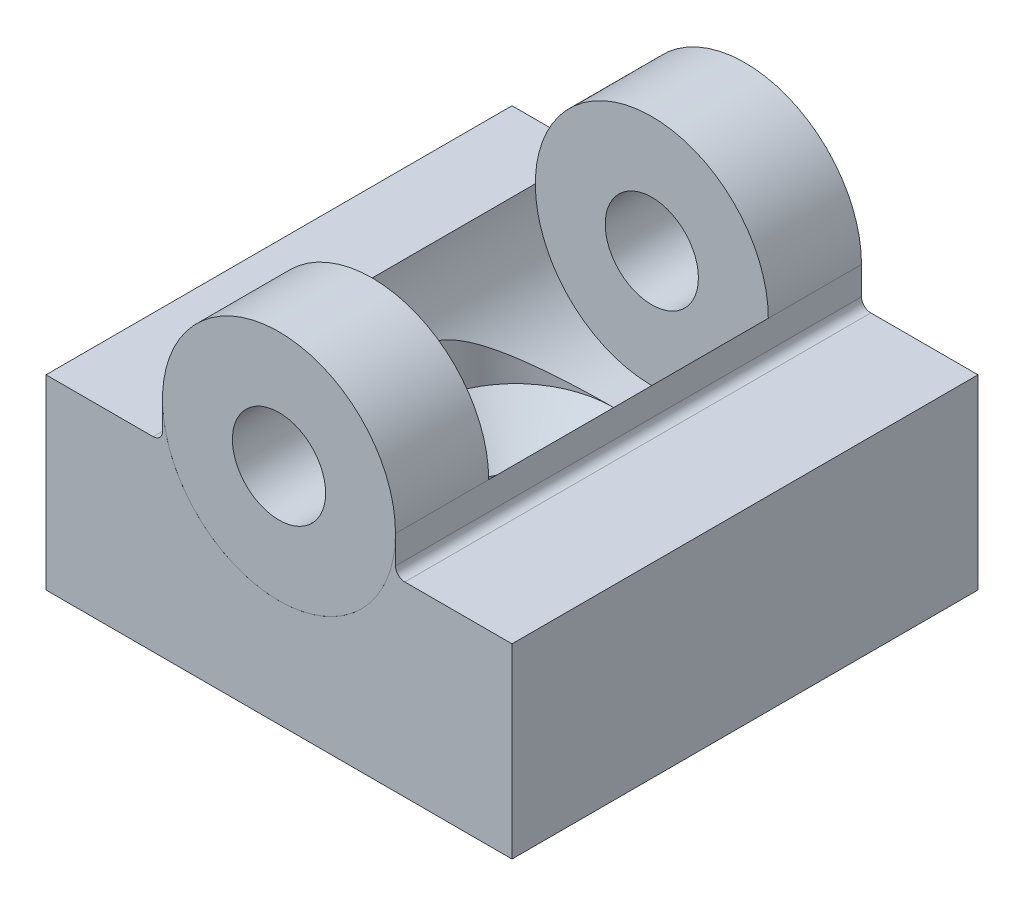
ISO-10303-21;
HEADER;
FILE_DESCRIPTION(('STEP AP214'),'2;1');
FILE_NAME('part.step','',(''),(''),'','','');
FILE_SCHEMA(('AUTOMOTIVE_DESIGN { 1 0 10303 214 1 1 1 1 }'));
ENDSEC;
DATA;
#1=APPLICATION_CONTEXT('core data for automotive mechanical design processes');
#2=APPLICATION_PROTOCOL_DEFINITION('international standard','automotive_design',2000,#1);
#3=PRODUCT_CONTEXT('',#1,'mechanical');
#4=PRODUCT('Part','Part','',(#3));
#5=PRODUCT_RELATED_PRODUCT_CATEGORY('part','',(#4));
#6=PRODUCT_DEFINITION_FORMATION('','',#4);
#7=PRODUCT_DEFINITION_CONTEXT('part definition',#1,'design');
#8=PRODUCT_DEFINITION('design','',#6,#7);
#9=PRODUCT_DEFINITION_SHAPE('','',#8);
#10=(LENGTH_UNIT() NAMED_UNIT(*) SI_UNIT(.MILLI.,.METRE.));
#11=(NAMED_UNIT(*) PLANE_ANGLE_UNIT() SI_UNIT($,.RADIAN.));
#12=(NAMED_UNIT(*) SI_UNIT($,.STERADIAN.) SOLID_ANGLE_UNIT());
#13=UNCERTAINTY_MEASURE_WITH_UNIT(LENGTH_MEASURE(1.E-05),#10,'distance_accuracy_value','');
#14=(GEOMETRIC_REPRESENTATION_CONTEXT(3) GLOBAL_UNCERTAINTY_ASSIGNED_CONTEXT((#13)) GLOBAL_UNIT_ASSIGNED_CONTEXT((#10,
#11,#12)) REPRESENTATION_CONTEXT('',''));
#15=CARTESIAN_POINT('',(0.,0.,0.));
#16=DIRECTION('',(0.,0.,1.));
#17=DIRECTION('',(1.,0.,0.));
#18=AXIS2_PLACEMENT_3D('',#15,#16,#17);
#19=CARTESIAN_POINT('',(0.,0.,-25.));
#20=DIRECTION('',(0.,0.,1.));
#21=DIRECTION('',(1.,0.,0.));
#22=AXIS2_PLACEMENT_3D('',#19,#20,#21);
#23=CYLINDRICAL_SURFACE('',#22,6.25);
#24=CARTESIAN_POINT('',(0.,0.,-5.));
#25=DIRECTION('',(0.,0.,-1.));
#26=DIRECTION('',(-1.,0.,0.));
#27=AXIS2_PLACEMENT_3D('',#24,#25,#26);
#28=CIRCLE('',#27,6.25);
#29=CARTESIAN_POINT('',(-6.25,0.,-5.));
#30=VERTEX_POINT('',#29);
#31=EDGE_CURVE('E63',#30,#30,#28,.F.);
#32=ORIENTED_EDGE('',*,*,#31,.T.);
#33=EDGE_LOOP('',(#32));
#34=FACE_BOUND('',#33,.T.);
#35=CARTESIAN_POINT('',(0.,0.,0.));
#36=DIRECTION('',(0.,0.,1.));
#37=DIRECTION('',(1.,0.,0.));
#38=AXIS2_PLACEMENT_3D('',#35,#36,#37);
#39=CIRCLE('',#38,6.25);
#40=CARTESIAN_POINT('',(6.25,0.,0.));
#41=VERTEX_POINT('',#40);
#42=EDGE_CURVE('E61',#41,#41,#39,.T.);
#43=ORIENTED_EDGE('',*,*,#42,.F.);
#44=EDGE_LOOP('',(#43));
#45=FACE_BOUND('',#44,.T.);
#46=ADVANCED_FACE('F50',(#34,#45),#23,.T.);
#47=CARTESIAN_POINT('',(0.,0.,0.));
#48=DIRECTION('',(0.,0.,1.));
#49=DIRECTION('',(1.,0.,0.));
#50=AXIS2_PLACEMENT_3D('',#47,#48,#49);
#51=PLANE('',#50);
#52=CARTESIAN_POINT('',(0.,0.,0.));
#53=DIRECTION('',(0.,0.,1.));
#54=DIRECTION('',(1.,0.,0.));
#55=AXIS2_PLACEMENT_3D('',#52,#53,#54);
#56=CIRCLE('',#55,2.5);
#57=CARTESIAN_POINT('',(2.5,0.,0.));
#58=VERTEX_POINT('',#57);
#59=EDGE_CURVE('E11',#58,#58,#56,.T.);
#60=ORIENTED_EDGE('',*,*,#59,.F.);
#61=EDGE_LOOP('',(#60));
#62=FACE_BOUND('',#61,.T.);
#63=ORIENTED_EDGE('',*,*,#42,.T.);
#64=EDGE_LOOP('',(#63));
#65=FACE_BOUND('',#64,.T.);
#66=ADVANCED_FACE('F70',(#62,#65),#51,.T.);
#67=CARTESIAN_POINT('',(0.,0.,-25.));
#68=DIRECTION('',(0.,0.,1.));
#69=DIRECTION('',(1.,0.,0.));
#70=AXIS2_PLACEMENT_3D('',#67,#68,#69);
#71=CYLINDRICAL_SURFACE('',#70,2.5);
#72=CARTESIAN_POINT('',(0.,0.,-5.));
#73=DIRECTION('',(0.,0.,1.));
#74=DIRECTION('',(1.,0.,0.));
#75=AXIS2_PLACEMENT_3D('',#72,#73,#74);
#76=CIRCLE('',#75,2.5);
#77=CARTESIAN_POINT('',(2.5,0.,-5.));
#78=VERTEX_POINT('',#77);
#79=EDGE_CURVE('E53',#78,#78,#76,.F.);
#80=ORIENTED_EDGE('',*,*,#79,.T.);
#81=EDGE_LOOP('',(#80));
#82=FACE_BOUND('',#81,.T.);
#83=ORIENTED_EDGE('',*,*,#59,.T.);
#84=EDGE_LOOP('',(#83));
#85=FACE_BOUND('',#84,.T.);
#86=ADVANCED_FACE('F76',(#82,#85),#71,.F.);
#87=CARTESIAN_POINT('',(12.5,8.,-5.));
#88=DIRECTION('',(0.,0.,-1.));
#89=DIRECTION('',(-1.,0.,0.));
#90=AXIS2_PLACEMENT_3D('',#87,#88,#89);
#91=PLANE('',#90);
#92=ORIENTED_EDGE('',*,*,#31,.F.);
#93=EDGE_LOOP('',(#92));
#94=FACE_BOUND('',#93,.T.);
#95=ORIENTED_EDGE('',*,*,#79,.F.);
#96=EDGE_LOOP('',(#95));
#97=FACE_BOUND('',#96,.T.);
#98=ADVANCED_FACE('F82',(#94,#97),#91,.T.);
#99=CLOSED_SHELL('',(#46,#66,#86,#98));
#100=MANIFOLD_SOLID_BREP('B2',#99);
#101=CARTESIAN_POINT('',(0.,0.,-25.));
#102=DIRECTION('',(0.,0.,1.));
#103=DIRECTION('',(1.,0.,0.));
#104=AXIS2_PLACEMENT_3D('',#101,#102,#103);
#105=CYLINDRICAL_SURFACE('',#104,6.25);
#106=CARTESIAN_POINT('',(-0.032829648804474,-6.24991377653799,-7.55398341161352));
#107=CARTESIAN_POINT('',(0.0907709354565521,-6.25056861167754,-7.55397771438197));
#108=CARTESIAN_POINT('',(0.214346050896278,-6.24754116273578,-7.55839413418667));
#109=CARTESIAN_POINT('',(0.460517917029361,-6.23422788729848,-7.57596285956335));
#110=CARTESIAN_POINT('',(0.583114518757096,-6.22394097618521,-7.58911647051951));
#111=CARTESIAN_POINT('',(0.826335584061813,-6.19634285493949,-7.62393195580067));
#112=CARTESIAN_POINT('',(0.9469591305949,-6.17902846993698,-7.64559767558189));
#113=CARTESIAN_POINT('',(1.18534497871478,-6.1377600396575,-7.69706956160622));
#114=CARTESIAN_POINT('',(1.30310597977651,-6.11380303560827,-7.72687935531639));
#115=CARTESIAN_POINT('',(1.53420363101333,-6.05992584333746,-7.79394840407313));
#116=CARTESIAN_POINT('',(1.64756420768233,-6.03004574012548,-7.83115758830922));
#117=CARTESIAN_POINT('',(1.87010588620569,-5.96478636087818,-7.91263452154438));
#118=CARTESIAN_POINT('',(1.97928513946406,-5.92940468674899,-7.95690534887966));
#119=CARTESIAN_POINT('',(2.29980037162074,-5.81589846132187,-8.09951816127072));
#120=CARTESIAN_POINT('',(2.50427743395993,-5.73037327241168,-8.20770898723961));
#121=CARTESIAN_POINT('',(2.83084378724597,-5.57409537577721,-8.40839415436184));
#122=CARTESIAN_POINT('',(2.95854741094598,-5.50721639514658,-8.49504289835207));
#123=CARTESIAN_POINT('',(3.20401547233302,-5.3681143451421,-8.67766531271182));
#124=CARTESIAN_POINT('',(3.32178005000831,-5.29589135106385,-8.77363885170365));
#125=CARTESIAN_POINT('',(3.54751080417675,-5.14742437521769,-8.97433428027539));
#126=CARTESIAN_POINT('',(3.65544965751731,-5.07117006016884,-9.07907909782631));
#127=CARTESIAN_POINT('',(3.86115064705177,-4.9163581557811,-9.29650616625642));
#128=CARTESIAN_POINT('',(3.95891405818206,-4.83780085658026,-9.40918741976288));
#129=CARTESIAN_POINT('',(4.14595526244734,-4.67855864153143,-9.644311986011));
#130=CARTESIAN_POINT('',(4.23504514737713,-4.59786109101064,-9.76689615317271));
#131=CARTESIAN_POINT('',(4.40259652953113,-4.43768793867032,-10.0199646583469));
#132=CARTESIAN_POINT('',(4.48105446984421,-4.35821275363671,-10.1504516192136));
#133=CARTESIAN_POINT('',(4.62685410782898,-4.20309564270996,-10.4191847799232));
#134=CARTESIAN_POINT('',(4.6942221570991,-4.12744493475341,-10.5574115087252));
#135=CARTESIAN_POINT('',(4.81743764214695,-3.98293901851119,-10.8421987903077));
#136=CARTESIAN_POINT('',(4.87329490989699,-3.9140780372017,-10.9887520932546));
#137=CARTESIAN_POINT('',(4.97732161788657,-3.78107692667185,-11.3051351870763));
#138=CARTESIAN_POINT('',(5.02424086981487,-3.71802206565054,-11.4758495756564));
#139=CARTESIAN_POINT('',(5.10094850208735,-3.61208978244585,-11.8270789727002));
#140=CARTESIAN_POINT('',(5.13077864342125,-3.56916321939747,-12.0075688996212));
#141=CARTESIAN_POINT('',(5.16114382375503,-3.52496734690448,-12.2842304941675));
#142=CARTESIAN_POINT('',(5.16887111284589,-3.51359453188649,-12.3780672801839));
#143=CARTESIAN_POINT('',(5.17917588283569,-3.49838973740657,-12.5666500065154));
#144=CARTESIAN_POINT('',(5.18175383356022,-3.49455706998212,-12.6613958630942));
#145=CARTESIAN_POINT('',(5.18167561213119,-3.49467251016551,-12.8508813552191));
#146=CARTESIAN_POINT('',(5.17901921082899,-3.49862095841383,-12.9456209903112));
#147=CARTESIAN_POINT('',(5.16855414464947,-3.5140622419634,-13.134194315822));
#148=CARTESIAN_POINT('',(5.16074484474169,-3.52555600712995,-13.228027893134));
#149=CARTESIAN_POINT('',(5.1392969974862,-3.5567557589277,-13.4220428803933));
#150=CARTESIAN_POINT('',(5.12521399937544,-3.57708422999091,-13.522074257149));
#151=CARTESIAN_POINT('',(5.091584466425,-3.62479254798272,-13.7195285428944));
#152=CARTESIAN_POINT('',(5.07203405316525,-3.65217739940761,-13.816949546208));
#153=CARTESIAN_POINT('',(5.0056741609726,-3.74317021722618,-14.1051224942175));
#154=CARTESIAN_POINT('',(4.95120244012317,-3.8155438080156,-14.2913875966399));
#155=CARTESIAN_POINT('',(4.83769503679313,-3.95799541174619,-14.6137237443912));
#156=CARTESIAN_POINT('',(4.78193430733067,-4.0254513970461,-14.7522075015738));
#157=CARTESIAN_POINT('',(4.66000817205581,-4.16599061582788,-15.0216489807916));
#158=CARTESIAN_POINT('',(4.59383671820223,-4.23907710764066,-15.1526022672856));
#159=CARTESIAN_POINT('',(4.45148546527647,-4.38832960839462,-15.4073481202116));
#160=CARTESIAN_POINT('',(4.37529229313715,-4.46449963632267,-15.531130794464));
#161=CARTESIAN_POINT('',(4.2131995443386,-4.61778025151078,-15.7714989227148));
#162=CARTESIAN_POINT('',(4.12730190236695,-4.69489064857358,-15.8880858041285));
#163=CARTESIAN_POINT('',(3.94123015796612,-4.85229884729575,-16.1197949039795));
#164=CARTESIAN_POINT('',(3.84055108078434,-4.93255839176105,-16.2345384666488));
#165=CARTESIAN_POINT('',(3.62854817790195,-5.09054273857371,-16.4556882033447));
#166=CARTESIAN_POINT('',(3.51722276821599,-5.16826716142577,-16.5620931324322));
#167=CARTESIAN_POINT('',(3.28418858670312,-5.31938289621794,-16.765700454338));
#168=CARTESIAN_POINT('',(3.16250183245773,-5.39278286204086,-16.8629214784465));
#169=CARTESIAN_POINT('',(2.9087497831676,-5.53378585002282,-17.0474690330793));
#170=CARTESIAN_POINT('',(2.77668452754756,-5.60138889420051,-17.1347956011865));
#171=CARTESIAN_POINT('',(2.43311851092882,-5.76142973820295,-17.3397534885816));
#172=CARTESIAN_POINT('',(2.21511944633804,-5.8492196624048,-17.4504862691286));
#173=CARTESIAN_POINT('',(1.87327395815397,-5.96388023286026,-17.5942197020304));
#174=CARTESIAN_POINT('',(1.75682015724332,-5.99926972210852,-17.6384114333014));
#175=CARTESIAN_POINT('',(1.51948495948136,-6.06372430126352,-17.7187641567077));
#176=CARTESIAN_POINT('',(1.39860543059943,-6.09279202425508,-17.754928492471));
#177=CARTESIAN_POINT('',(1.15218919694772,-6.14417850830022,-17.8189005378598));
#178=CARTESIAN_POINT('',(1.0266233453985,-6.16644240249825,-17.8466403001839));
#179=CARTESIAN_POINT('',(0.772688770814152,-6.20337877278453,-17.8928720676528));
#180=CARTESIAN_POINT('',(0.644320042287346,-6.21805123399749,-17.9113640546766));
#181=CARTESIAN_POINT('',(0.385963953037913,-6.23941700463409,-17.9387219470471));
#182=CARTESIAN_POINT('',(0.25597744364089,-6.24611434515874,-17.9475927153284));
#183=CARTESIAN_POINT('',(-0.00445254605249993,-6.25135480771328,-17.9555366762046));
#184=CARTESIAN_POINT('',(-0.13489597663976,-6.24989879081209,-17.9546109033945));
#185=CARTESIAN_POINT('',(-0.379586318568259,-6.23951845347103,-17.9436759334023));
#186=CARTESIAN_POINT('',(-0.493922861092483,-6.23149847631669,-17.9347548164763));
#187=CARTESIAN_POINT('',(-0.721201355325021,-6.20930025768536,-17.909461517927));
#188=CARTESIAN_POINT('',(-0.834142838661356,-6.19512000283241,-17.8930869001774));
#189=CARTESIAN_POINT('',(-1.05779865713948,-6.16087276920974,-17.8531427258176));
#190=CARTESIAN_POINT('',(-1.16851369058244,-6.14080766792579,-17.8295754638324));
#191=CARTESIAN_POINT('',(-1.38711266038723,-6.09515465512442,-17.7755855763967));
#192=CARTESIAN_POINT('',(-1.49499550141378,-6.0695646411657,-17.7451603410296));
#193=CARTESIAN_POINT('',(-1.81675836935903,-5.98427178548456,-17.6431429814976));
#194=CARTESIAN_POINT('',(-2.02542156107811,-5.91657174200649,-17.5614161851876));
#195=CARTESIAN_POINT('',(-2.42533540430524,-5.76421429863157,-17.3748961895888));
#196=CARTESIAN_POINT('',(-2.61657970320112,-5.67955074793334,-17.2700946222473));
#197=CARTESIAN_POINT('',(-2.93019135016616,-5.52252173465221,-17.0722908846161));
#198=CARTESIAN_POINT('',(-3.05706178745247,-5.45315354862335,-16.9839381502401));
#199=CARTESIAN_POINT('',(-3.3006195415808,-5.30927592237061,-16.7978806205299));
#200=CARTESIAN_POINT('',(-3.41730648028319,-5.2347662914154,-16.7001754781988));
#201=CARTESIAN_POINT('',(-3.64073538650715,-5.08192141323803,-16.49592740488));
#202=CARTESIAN_POINT('',(-3.74744557606367,-5.00357507715668,-16.3893581490853));
#203=CARTESIAN_POINT('',(-3.95050379295553,-4.84485502691233,-16.1682166752581));
#204=CARTESIAN_POINT('',(-4.04685329786323,-4.76448160386283,-16.0536456022464));
#205=CARTESIAN_POINT('',(-4.23082748796061,-4.60194809528264,-15.8146656789086));
#206=CARTESIAN_POINT('',(-4.31826611280903,-4.51978169313954,-15.6901179073718));
#207=CARTESIAN_POINT('',(-4.48235267478205,-4.35710452694745,-15.4329865908352));
#208=CARTESIAN_POINT('',(-4.55899659855893,-4.27659438812824,-15.3004000831936));
#209=CARTESIAN_POINT('',(-4.70096155144904,-4.1200225026454,-15.0273603652426));
#210=CARTESIAN_POINT('',(-4.76631411963698,-4.04394877182517,-14.886930565943));
#211=CARTESIAN_POINT('',(-4.88528934958464,-3.89938494149429,-14.5975650767213));
#212=CARTESIAN_POINT('',(-4.93892319033239,-3.83088764558279,-14.4486376656214));
#213=CARTESIAN_POINT('',(-5.03695673130948,-3.70116725767165,-14.1305669672743));
#214=CARTESIAN_POINT('',(-5.08038793152562,-3.64084890706665,-13.9607423608672));
#215=CARTESIAN_POINT('',(-5.1504870314259,-3.54101693480501,-13.6118217979422));
#216=CARTESIAN_POINT('',(-5.17719750898742,-3.50145051220956,-13.4327506574462));
#217=CARTESIAN_POINT('',(-5.20329648372045,-3.46243051574174,-13.1589296232035));
#218=CARTESIAN_POINT('',(-5.20966364315183,-3.45281691158681,-13.0662171133989));
#219=CARTESIAN_POINT('',(-5.21744996951295,-3.44104280025811,-12.8800948316664));
#220=CARTESIAN_POINT('',(-5.21886951564227,-3.43888172190105,-12.7866851137245));
#221=CARTESIAN_POINT('',(-5.21671210189387,-3.44215281534789,-12.6000462108624));
#222=CARTESIAN_POINT('',(-5.21313427534646,-3.44758630424024,-12.5068170600652));
#223=CARTESIAN_POINT('',(-5.20108227290867,-3.46574094921466,-12.3213561164757));
#224=CARTESIAN_POINT('',(-5.19260550315752,-3.47846596593735,-12.2291248784266));
#225=CARTESIAN_POINT('',(-5.1696455151337,-3.51251098279683,-12.0352485760542));
#226=CARTESIAN_POINT('',(-5.15455593284577,-3.53468981701324,-11.9338269493197));
#227=CARTESIAN_POINT('',(-5.11886168355254,-3.58618727044439,-11.7337785872273));
#228=CARTESIAN_POINT('',(-5.09825292798568,-3.61551118121953,-11.6351539840257));
#229=CARTESIAN_POINT('',(-5.02864547064589,-3.71234397447988,-11.343601660327));
#230=CARTESIAN_POINT('',(-4.97191512604155,-3.78863493035017,-11.1553920817538));
#231=CARTESIAN_POINT('',(-4.85406021630779,-3.93798558385592,-10.8297398386408));
#232=CARTESIAN_POINT('',(-4.79624362448485,-4.00847815470371,-10.6898215760947));
#233=CARTESIAN_POINT('',(-4.66995570058632,-4.15492005768358,-10.4177454209447));
#234=CARTESIAN_POINT('',(-4.60147826714121,-4.23087250110536,-10.2855920323324));
#235=CARTESIAN_POINT('',(-4.45421139531331,-4.38565143770196,-10.02868479613));
#236=CARTESIAN_POINT('',(-4.37540835866662,-4.46448162017841,-9.90394102708302));
#237=CARTESIAN_POINT('',(-4.20774883648589,-4.6228399085393,-9.6619250290723));
#238=CARTESIAN_POINT('',(-4.1188943626213,-4.70236787184297,-9.54465131238904));
#239=CARTESIAN_POINT('',(-3.92683294976693,-4.86404755204109,-9.31243870138163));
#240=CARTESIAN_POINT('',(-3.82315332154757,-4.94615130583881,-9.19785640699048));
#241=CARTESIAN_POINT('',(-3.60480608341289,-5.10747585472283,-8.97739810039636));
#242=CARTESIAN_POINT('',(-3.4901367038541,-5.18669618265718,-8.87152349548154));
#243=CARTESIAN_POINT('',(-3.25006766687363,-5.34039482997348,-8.66943354032725));
#244=CARTESIAN_POINT('',(-3.1246896418644,-5.41488220297438,-8.57319953196062));
#245=CARTESIAN_POINT('',(-2.86329806942894,-5.55753791008405,-8.39123756496163));
#246=CARTESIAN_POINT('',(-2.72728890417057,-5.62570882278492,-8.30550531451346));
#247=CARTESIAN_POINT('',(-2.37962433637709,-5.78369246324515,-8.10882654837077));
#248=CARTESIAN_POINT('',(-2.1619965917983,-5.86899782165749,-8.00447158245464));
#249=CARTESIAN_POINT('',(-1.82156348856249,-5.97985805245966,-7.87029630046952));
#250=CARTESIAN_POINT('',(-1.7057828173295,-6.01395580295755,-7.82930443222483));
#251=CARTESIAN_POINT('',(-1.47007310015206,-6.07587211950921,-7.75527874162411));
#252=CARTESIAN_POINT('',(-1.35014474385258,-6.10369172371083,-7.72224360349046));
#253=CARTESIAN_POINT('',(-1.03522468860036,-6.16681311820677,-7.64773129272976));
#254=CARTESIAN_POINT('',(-0.83757780108011,-6.19688926233151,-7.61271999075591));
#255=CARTESIAN_POINT('',(-0.437541042789686,-6.23790353590448,-7.56585084176373));
#256=CARTESIAN_POINT('',(-0.235151224761653,-6.24884187806585,-7.55399273740169));
#257=CARTESIAN_POINT('',(-0.032829648804474,-6.24991377653799,-7.55398341161352));
#258=B_SPLINE_CURVE_WITH_KNOTS('',3,(#106,#107,#108,#109,#110,#111,#112,#113,#114,#115,#116,
#117,#118,#119,#120,#121,#122,#123,#124,#125,#126,#127,#128,#129,#130,#131,#132,#133,#134,#135,
#136,#137,#138,#139,#140,#141,#142,#143,#144,#145,#146,#147,#148,#149,#150,#151,#152,#153,#154,
#155,#156,#157,#158,#159,#160,#161,#162,#163,#164,#165,#166,#167,#168,#169,#170,#171,#172,#173,
#174,#175,#176,#177,#178,#179,#180,#181,#182,#183,#184,#185,#186,#187,#188,#189,#190,#191,#192,
#193,#194,#195,#196,#197,#198,#199,#200,#201,#202,#203,#204,#205,#206,#207,#208,#209,#210,#211,
#212,#213,#214,#215,#216,#217,#218,#219,#220,#221,#222,#223,#224,#225,#226,#227,#228,#229,#230,
#231,#232,#233,#234,#235,#236,#237,#238,#239,#240,#241,#242,#243,#244,#245,#246,#247,#248,#249,
#250,#251,#252,#253,#254,#255,#256,#257),.UNSPECIFIED.,.T.,.F.,(4,2,2,2,2,2,2,2,2,2,2,2,2,2,2,2,
2,2,2,2,2,2,2,2,2,2,2,2,2,2,2,2,2,2,2,2,2,2,2,2,2,2,2,2,2,2,2,2,2,2,2,2,2,2,2,2,2,2,2,2,2,2,2,2,
2,2,2,2,2,2,2,2,2,2,2,4),(0.,0.370597461018452,0.741250303783813,1.11207078670446,
1.48305670750443,1.85161276875707,2.22032993355494,2.95724442410103,3.46126339793966,
3.96527527164886,4.47064841048188,4.97595815195047,5.49051009384125,6.00523375603689,
6.51871611234933,7.03175804127558,7.59397885697063,8.1548198369434,8.43895144305536,
8.72305712381691,9.00717524238869,9.29132838151508,9.59997527834937,9.90884167782583,
10.527777260031,11.018680986514,11.5098709605436,12.0017231615042,12.4934774790396,
13.0103375965857,13.5272747337382,14.0431395704881,14.5590024477224,15.3347689215858,
15.7228453163635,16.1107597621954,16.5017245195154,16.8926900429221,17.2834578650702,
17.6741844193504,18.0186647083187,18.3632576692764,18.7077408115807,19.0523552747229,
19.7517477293578,20.4513942372557,20.9591171551502,21.4668589180949,21.9761664546532,
22.4854012605372,23.003710129636,23.5222111942779,24.0392397047955,24.5557728255502,
25.110272556974,25.6633544968837,25.9432601053748,26.223144260608,26.5030769607965,
26.783158013909,27.0973908604398,27.4118571352815,28.0419968981301,28.5424333188647,
29.0431572074094,29.5445472775588,30.0458371777007,30.570226373374,31.0947001520448,
31.6181384311985,32.1413620749377,32.9057473197748,33.2877598578945,33.6697091804497,
34.276346246198,34.8829765692443),.UNSPECIFIED.);
#259=CARTESIAN_POINT('',(-0.032829648804474,-6.24991377653799,-17.9539834116135));
#260=VERTEX_POINT('',#259);
#261=CARTESIAN_POINT('',(-0.032829648804474,-6.24991377653799,-7.55398341161352));
#262=VERTEX_POINT('',#261);
#263=EDGE_CURVE('E211',#260,#262,#258,.T.);
#264=ORIENTED_EDGE('',*,*,#263,.F.);
#265=EDGE_CURVE('E216',#262,#260,#258,.T.);
#266=ORIENTED_EDGE('',*,*,#265,.F.);
#267=EDGE_LOOP('',(#264,#266));
#268=FACE_BOUND('',#267,.T.);
#269=CARTESIAN_POINT('',(0.,0.,0.));
#270=DIRECTION('',(0.,0.,-1.));
#271=DIRECTION('',(1.,0.,0.));
#272=AXIS2_PLACEMENT_3D('',#269,#270,#271);
#273=CIRCLE('',#272,6.25);
#274=CARTESIAN_POINT('',(6.25,0.,0.));
#275=VERTEX_POINT('',#274);
#276=CARTESIAN_POINT('',(-6.25,0.,0.));
#277=VERTEX_POINT('',#276);
#278=EDGE_CURVE('E223',#275,#277,#273,.T.);
#279=ORIENTED_EDGE('',*,*,#278,.F.);
#280=DIRECTION('',(0.,0.,1.));
#281=VECTOR('',#280,1.);
#282=CARTESIAN_POINT('',(6.25,0.,-25.));
#283=LINE('',#282,#281);
#284=CARTESIAN_POINT('',(6.25,0.,-25.));
#285=VERTEX_POINT('',#284);
#286=EDGE_CURVE('E295',#285,#275,#283,.T.);
#287=ORIENTED_EDGE('',*,*,#286,.F.);
#288=CARTESIAN_POINT('',(0.,0.,-25.));
#289=DIRECTION('',(0.,0.,-1.));
#290=DIRECTION('',(1.,0.,0.));
#291=AXIS2_PLACEMENT_3D('',#288,#289,#290);
#292=CIRCLE('',#291,6.25);
#293=CARTESIAN_POINT('',(-6.25,0.,-25.));
#294=VERTEX_POINT('',#293);
#295=EDGE_CURVE('E234',#285,#294,#292,.T.);
#296=ORIENTED_EDGE('',*,*,#295,.T.);
#297=DIRECTION('',(0.,0.,1.));
#298=VECTOR('',#297,1.);
#299=CARTESIAN_POINT('',(-6.25,0.,-25.));
#300=LINE('',#299,#298);
#301=EDGE_CURVE('E296',#294,#277,#300,.T.);
#302=ORIENTED_EDGE('',*,*,#301,.T.);
#303=EDGE_LOOP('',(#279,#287,#296,#302));
#304=FACE_BOUND('',#303,.T.);
#305=ADVANCED_FACE('F122',(#268,#304),#105,.F.);
#306=CARTESIAN_POINT('',(6.25,0.,-25.));
#307=DIRECTION('',(1.,0.,0.));
#308=DIRECTION('',(0.,1.,0.));
#309=AXIS2_PLACEMENT_3D('',#306,#307,#308);
#310=PLANE('',#309);
#311=DIRECTION('',(0.,1.,0.));
#312=VECTOR('',#311,1.);
#313=CARTESIAN_POINT('',(6.25,0.,0.));
#314=LINE('',#313,#312);
#315=CARTESIAN_POINT('',(6.25,-1.5,0.));
#316=VERTEX_POINT('',#315);
#317=EDGE_CURVE('E310',#316,#275,#314,.T.);
#318=ORIENTED_EDGE('',*,*,#317,.F.);
#319=DIRECTION('',(0.,0.,1.));
#320=VECTOR('',#319,1.);
#321=CARTESIAN_POINT('',(6.25,-1.5,-25.));
#322=LINE('',#321,#320);
#323=CARTESIAN_POINT('',(6.25,-1.5,-25.));
#324=VERTEX_POINT('',#323);
#325=EDGE_CURVE('E138',#316,#324,#322,.F.);
#326=ORIENTED_EDGE('',*,*,#325,.T.);
#327=DIRECTION('',(0.,1.,0.));
#328=VECTOR('',#327,1.);
#329=CARTESIAN_POINT('',(6.25,0.,-25.));
#330=LINE('',#329,#328);
#331=EDGE_CURVE('E299',#324,#285,#330,.T.);
#332=ORIENTED_EDGE('',*,*,#331,.T.);
#333=ORIENTED_EDGE('',*,*,#286,.T.);
#334=EDGE_LOOP('',(#318,#326,#332,#333));
#335=FACE_BOUND('',#334,.T.);
#336=ADVANCED_FACE('F251',(#335),#310,.T.);
#337=CARTESIAN_POINT('',(6.25,-2.,-25.));
#338=DIRECTION('',(0.,1.,0.));
#339=DIRECTION('',(0.,0.,1.));
#340=AXIS2_PLACEMENT_3D('',#337,#338,#339);
#341=PLANE('',#340);
#342=DIRECTION('',(-1.,0.,0.));
#343=VECTOR('',#342,1.);
#344=CARTESIAN_POINT('',(6.25,-2.,-25.));
#345=LINE('',#344,#343);
#346=CARTESIAN_POINT('',(12.5,-2.,-25.));
#347=VERTEX_POINT('',#346);
#348=CARTESIAN_POINT('',(6.75,-2.,-25.));
#349=VERTEX_POINT('',#348);
#350=EDGE_CURVE('E328',#347,#349,#345,.T.);
#351=ORIENTED_EDGE('',*,*,#350,.T.);
#352=DIRECTION('',(0.,0.,1.));
#353=VECTOR('',#352,1.);
#354=CARTESIAN_POINT('',(6.75,-2.,0.));
#355=LINE('',#354,#353);
#356=CARTESIAN_POINT('',(6.75,-2.,0.));
#357=VERTEX_POINT('',#356);
#358=EDGE_CURVE('E290',#349,#357,#355,.T.);
#359=ORIENTED_EDGE('',*,*,#358,.T.);
#360=DIRECTION('',(-1.,0.,0.));
#361=VECTOR('',#360,1.);
#362=CARTESIAN_POINT('',(6.25,-2.,0.));
#363=LINE('',#362,#361);
#364=CARTESIAN_POINT('',(12.5,-2.,0.));
#365=VERTEX_POINT('',#364);
#366=EDGE_CURVE('E312',#365,#357,#363,.T.);
#367=ORIENTED_EDGE('',*,*,#366,.F.);
#368=DIRECTION('',(0.,0.,1.));
#369=VECTOR('',#368,1.);
#370=CARTESIAN_POINT('',(12.5,-2.,-25.));
#371=LINE('',#370,#369);
#372=EDGE_CURVE('E306',#347,#365,#371,.T.);
#373=ORIENTED_EDGE('',*,*,#372,.F.);
#374=EDGE_LOOP('',(#351,#359,#367,#373));
#375=FACE_BOUND('',#374,.T.);
#376=ADVANCED_FACE('F258',(#375),#341,.T.);
#377=CARTESIAN_POINT('',(12.5,-2.,-25.));
#378=DIRECTION('',(1.,0.,0.));
#379=DIRECTION('',(0.,1.,0.));
#380=AXIS2_PLACEMENT_3D('',#377,#378,#379);
#381=PLANE('',#380);
#382=DIRECTION('',(0.,1.,0.));
#383=VECTOR('',#382,1.);
#384=CARTESIAN_POINT('',(12.5,-2.,0.));
#385=LINE('',#384,#383);
#386=CARTESIAN_POINT('',(12.5,-12.,0.));
#387=VERTEX_POINT('',#386);
#388=EDGE_CURVE('E314',#387,#365,#385,.T.);
#389=ORIENTED_EDGE('',*,*,#388,.F.);
#390=DIRECTION('',(0.,0.,1.));
#391=VECTOR('',#390,1.);
#392=CARTESIAN_POINT('',(12.5,-12.,-25.));
#393=LINE('',#392,#391);
#394=CARTESIAN_POINT('',(12.5,-12.,-25.));
#395=VERTEX_POINT('',#394);
#396=EDGE_CURVE('E304',#395,#387,#393,.T.);
#397=ORIENTED_EDGE('',*,*,#396,.F.);
#398=DIRECTION('',(0.,1.,0.));
#399=VECTOR('',#398,1.);
#400=CARTESIAN_POINT('',(12.5,-2.,-25.));
#401=LINE('',#400,#399);
#402=EDGE_CURVE('E331',#395,#347,#401,.T.);
#403=ORIENTED_EDGE('',*,*,#402,.T.);
#404=ORIENTED_EDGE('',*,*,#372,.T.);
#405=EDGE_LOOP('',(#389,#397,#403,#404));
#406=FACE_BOUND('',#405,.T.);
#407=ADVANCED_FACE('F356',(#406),#381,.T.);
#408=CARTESIAN_POINT('',(-12.5,-12.,-25.));
#409=DIRECTION('',(0.,-1.,0.));
#410=DIRECTION('',(0.,0.,-1.));
#411=AXIS2_PLACEMENT_3D('',#408,#409,#410);
#412=PLANE('',#411);
#413=CARTESIAN_POINT('',(-0.0630337953033178,-12.,-12.7539834116135));
#414=DIRECTION('',(0.,-1.,0.));
#415=DIRECTION('',(1.,0.,0.));
#416=AXIS2_PLACEMENT_3D('',#413,#414,#415);
#417=ELLIPSE('',#416,2.75003793884667,2.74999999999999);
#418=CARTESIAN_POINT('',(2.68700414354335,-12.,-12.7539834116135));
#419=VERTEX_POINT('',#418);
#420=EDGE_CURVE('E126',#419,#419,#417,.T.);
#421=ORIENTED_EDGE('',*,*,#420,.F.);
#422=EDGE_LOOP('',(#421));
#423=FACE_BOUND('',#422,.T.);
#424=DIRECTION('',(1.,0.,0.));
#425=VECTOR('',#424,1.);
#426=CARTESIAN_POINT('',(-12.5,-12.,0.));
#427=LINE('',#426,#425);
#428=CARTESIAN_POINT('',(-12.5,-12.,0.));
#429=VERTEX_POINT('',#428);
#430=EDGE_CURVE('E317',#429,#387,#427,.T.);
#431=ORIENTED_EDGE('',*,*,#430,.F.);
#432=DIRECTION('',(0.,0.,1.));
#433=VECTOR('',#432,1.);
#434=CARTESIAN_POINT('',(-12.5,-12.,-25.));
#435=LINE('',#434,#433);
#436=CARTESIAN_POINT('',(-12.5,-12.,-25.));
#437=VERTEX_POINT('',#436);
#438=EDGE_CURVE('E302',#437,#429,#435,.T.);
#439=ORIENTED_EDGE('',*,*,#438,.F.);
#440=DIRECTION('',(1.,0.,0.));
#441=VECTOR('',#440,1.);
#442=CARTESIAN_POINT('',(-12.5,-12.,-25.));
#443=LINE('',#442,#441);
#444=EDGE_CURVE('E334',#437,#395,#443,.T.);
#445=ORIENTED_EDGE('',*,*,#444,.T.);
#446=ORIENTED_EDGE('',*,*,#396,.T.);
#447=EDGE_LOOP('',(#431,#439,#445,#446));
#448=FACE_BOUND('',#447,.T.);
#449=ADVANCED_FACE('F361',(#423,#448),#412,.T.);
#450=CARTESIAN_POINT('',(-12.5,-12.,-25.));
#451=DIRECTION('',(-1.,0.,0.));
#452=DIRECTION('',(0.,0.,1.));
#453=AXIS2_PLACEMENT_3D('',#450,#451,#452);
#454=PLANE('',#453);
#455=DIRECTION('',(0.,-1.,0.));
#456=VECTOR('',#455,1.);
#457=CARTESIAN_POINT('',(-12.5,-12.,0.));
#458=LINE('',#457,#456);
#459=CARTESIAN_POINT('',(-12.5,-2.,0.));
#460=VERTEX_POINT('',#459);
#461=EDGE_CURVE('E320',#460,#429,#458,.T.);
#462=ORIENTED_EDGE('',*,*,#461,.F.);
#463=DIRECTION('',(0.,0.,1.));
#464=VECTOR('',#463,1.);
#465=CARTESIAN_POINT('',(-12.5,-2.,-25.));
#466=LINE('',#465,#464);
#467=CARTESIAN_POINT('',(-12.5,-2.,-25.));
#468=VERTEX_POINT('',#467);
#469=EDGE_CURVE('E298',#468,#460,#466,.T.);
#470=ORIENTED_EDGE('',*,*,#469,.F.);
#471=DIRECTION('',(0.,-1.,0.));
#472=VECTOR('',#471,1.);
#473=CARTESIAN_POINT('',(-12.5,-12.,-25.));
#474=LINE('',#473,#472);
#475=EDGE_CURVE('E337',#468,#437,#474,.T.);
#476=ORIENTED_EDGE('',*,*,#475,.T.);
#477=ORIENTED_EDGE('',*,*,#438,.T.);
#478=EDGE_LOOP('',(#462,#470,#476,#477));
#479=FACE_BOUND('',#478,.T.);
#480=ADVANCED_FACE('F364',(#479),#454,.T.);
#481=CARTESIAN_POINT('',(-12.5,-2.,-25.));
#482=DIRECTION('',(0.,1.,0.));
#483=DIRECTION('',(0.,0.,1.));
#484=AXIS2_PLACEMENT_3D('',#481,#482,#483);
#485=PLANE('',#484);
#486=DIRECTION('',(-1.,0.,0.));
#487=VECTOR('',#486,1.);
#488=CARTESIAN_POINT('',(-12.5,-2.,0.));
#489=LINE('',#488,#487);
#490=CARTESIAN_POINT('',(-6.75,-2.,0.));
#491=VERTEX_POINT('',#490);
#492=EDGE_CURVE('E323',#491,#460,#489,.T.);
#493=ORIENTED_EDGE('',*,*,#492,.F.);
#494=DIRECTION('',(0.,0.,1.));
#495=VECTOR('',#494,1.);
#496=CARTESIAN_POINT('',(-6.75,-2.,-25.));
#497=LINE('',#496,#495);
#498=CARTESIAN_POINT('',(-6.75,-2.,-25.));
#499=VERTEX_POINT('',#498);
#500=EDGE_CURVE('E277',#491,#499,#497,.F.);
#501=ORIENTED_EDGE('',*,*,#500,.T.);
#502=DIRECTION('',(-1.,0.,0.));
#503=VECTOR('',#502,1.);
#504=CARTESIAN_POINT('',(-12.5,-2.,-25.));
#505=LINE('',#504,#503);
#506=EDGE_CURVE('E340',#499,#468,#505,.T.);
#507=ORIENTED_EDGE('',*,*,#506,.T.);
#508=ORIENTED_EDGE('',*,*,#469,.T.);
#509=EDGE_LOOP('',(#493,#501,#507,#508));
#510=FACE_BOUND('',#509,.T.);
#511=ADVANCED_FACE('F368',(#510),#485,.T.);
#512=CARTESIAN_POINT('',(-6.25,0.,-25.));
#513=DIRECTION('',(-1.,0.,0.));
#514=DIRECTION('',(0.,-1.,0.));
#515=AXIS2_PLACEMENT_3D('',#512,#513,#514);
#516=PLANE('',#515);
#517=DIRECTION('',(0.,-1.,0.));
#518=VECTOR('',#517,1.);
#519=CARTESIAN_POINT('',(-6.25,0.,-25.));
#520=LINE('',#519,#518);
#521=CARTESIAN_POINT('',(-6.25,-1.5,-25.));
#522=VERTEX_POINT('',#521);
#523=EDGE_CURVE('E341',#294,#522,#520,.T.);
#524=ORIENTED_EDGE('',*,*,#523,.T.);
#525=DIRECTION('',(0.,0.,1.));
#526=VECTOR('',#525,1.);
#527=CARTESIAN_POINT('',(-6.25,-1.5,0.));
#528=LINE('',#527,#526);
#529=CARTESIAN_POINT('',(-6.25,-1.5,0.));
#530=VERTEX_POINT('',#529);
#531=EDGE_CURVE('E279',#522,#530,#528,.T.);
#532=ORIENTED_EDGE('',*,*,#531,.T.);
#533=DIRECTION('',(0.,-1.,0.));
#534=VECTOR('',#533,1.);
#535=CARTESIAN_POINT('',(-6.25,0.,0.));
#536=LINE('',#535,#534);
#537=EDGE_CURVE('E225',#277,#530,#536,.T.);
#538=ORIENTED_EDGE('',*,*,#537,.F.);
#539=ORIENTED_EDGE('',*,*,#301,.F.);
#540=EDGE_LOOP('',(#524,#532,#538,#539));
#541=FACE_BOUND('',#540,.T.);
#542=ADVANCED_FACE('F261',(#541),#516,.T.);
#543=CARTESIAN_POINT('',(0.,0.,-25.));
#544=DIRECTION('',(0.,0.,1.));
#545=DIRECTION('',(1.,0.,0.));
#546=AXIS2_PLACEMENT_3D('',#543,#544,#545);
#547=PLANE('',#546);
#548=ORIENTED_EDGE('',*,*,#295,.F.);
#549=ORIENTED_EDGE('',*,*,#331,.F.);
#550=CARTESIAN_POINT('',(6.75,-1.5,-25.));
#551=DIRECTION('',(0.,0.,1.));
#552=DIRECTION('',(1.,0.,0.));
#553=AXIS2_PLACEMENT_3D('',#550,#551,#552);
#554=CIRCLE('',#553,0.5);
#555=EDGE_CURVE('E48',#324,#349,#554,.T.);
#556=ORIENTED_EDGE('',*,*,#555,.T.);
#557=ORIENTED_EDGE('',*,*,#350,.F.);
#558=ORIENTED_EDGE('',*,*,#402,.F.);
#559=ORIENTED_EDGE('',*,*,#444,.F.);
#560=ORIENTED_EDGE('',*,*,#475,.F.);
#561=ORIENTED_EDGE('',*,*,#506,.F.);
#562=CARTESIAN_POINT('',(-6.75,-1.5,-25.));
#563=DIRECTION('',(0.,0.,1.));
#564=DIRECTION('',(1.,0.,0.));
#565=AXIS2_PLACEMENT_3D('',#562,#563,#564);
#566=CIRCLE('',#565,0.5);
#567=EDGE_CURVE('E276',#499,#522,#566,.T.);
#568=ORIENTED_EDGE('',*,*,#567,.T.);
#569=ORIENTED_EDGE('',*,*,#523,.F.);
#570=EDGE_LOOP('',(#548,#549,#556,#557,#558,#559,#560,#561,#568,#569));
#571=FACE_BOUND('',#570,.T.);
#572=ADVANCED_FACE('F271',(#571),#547,.F.);
#573=CARTESIAN_POINT('',(0.,0.,0.));
#574=DIRECTION('',(0.,0.,1.));
#575=DIRECTION('',(1.,0.,0.));
#576=AXIS2_PLACEMENT_3D('',#573,#574,#575);
#577=PLANE('',#576);
#578=ORIENTED_EDGE('',*,*,#278,.T.);
#579=ORIENTED_EDGE('',*,*,#537,.T.);
#580=CARTESIAN_POINT('',(-6.75,-1.5,0.));
#581=DIRECTION('',(0.,0.,1.));
#582=DIRECTION('',(1.,0.,0.));
#583=AXIS2_PLACEMENT_3D('',#580,#581,#582);
#584=CIRCLE('',#583,0.5);
#585=EDGE_CURVE('E284',#530,#491,#584,.F.);
#586=ORIENTED_EDGE('',*,*,#585,.T.);
#587=ORIENTED_EDGE('',*,*,#492,.T.);
#588=ORIENTED_EDGE('',*,*,#461,.T.);
#589=ORIENTED_EDGE('',*,*,#430,.T.);
#590=ORIENTED_EDGE('',*,*,#388,.T.);
#591=ORIENTED_EDGE('',*,*,#366,.T.);
#592=CARTESIAN_POINT('',(6.75,-1.5,0.));
#593=DIRECTION('',(0.,0.,1.));
#594=DIRECTION('',(1.,0.,0.));
#595=AXIS2_PLACEMENT_3D('',#592,#593,#594);
#596=CIRCLE('',#595,0.5);
#597=EDGE_CURVE('E131',#357,#316,#596,.F.);
#598=ORIENTED_EDGE('',*,*,#597,.T.);
#599=ORIENTED_EDGE('',*,*,#317,.T.);
#600=EDGE_LOOP('',(#578,#579,#586,#587,#588,#589,#590,#591,#598,#599));
#601=FACE_BOUND('',#600,.T.);
#602=ADVANCED_FACE('F265',(#601),#577,.T.);
#603=CARTESIAN_POINT('',(-6.75,-1.5,-25.));
#604=DIRECTION('',(0.,0.,-1.));
#605=DIRECTION('',(-1.,0.,0.));
#606=AXIS2_PLACEMENT_3D('',#603,#604,#605);
#607=CYLINDRICAL_SURFACE('',#606,0.5);
#608=ORIENTED_EDGE('',*,*,#567,.F.);
#609=ORIENTED_EDGE('',*,*,#500,.F.);
#610=ORIENTED_EDGE('',*,*,#585,.F.);
#611=ORIENTED_EDGE('',*,*,#531,.F.);
#612=EDGE_LOOP('',(#608,#609,#610,#611));
#613=FACE_BOUND('',#612,.T.);
#614=ADVANCED_FACE('F263',(#613),#607,.F.);
#615=CARTESIAN_POINT('',(6.75,-1.5,-25.));
#616=DIRECTION('',(0.,0.,-1.));
#617=DIRECTION('',(-1.,0.,0.));
#618=AXIS2_PLACEMENT_3D('',#615,#616,#617);
#619=CYLINDRICAL_SURFACE('',#618,0.5);
#620=ORIENTED_EDGE('',*,*,#555,.F.);
#621=ORIENTED_EDGE('',*,*,#325,.F.);
#622=ORIENTED_EDGE('',*,*,#597,.F.);
#623=ORIENTED_EDGE('',*,*,#358,.F.);
#624=EDGE_LOOP('',(#620,#621,#622,#623));
#625=FACE_BOUND('',#624,.T.);
#626=ADVANCED_FACE('F124',(#625),#619,.F.);
#627=CARTESIAN_POINT('',(-0.0328296488044729,-6.24991377653799,-12.7539834116135));
#628=DIRECTION('',(0.00525274380871584,0.999986204246079,0.));
#629=DIRECTION('',(-0.999986204246079,0.00525274380871584,0.));
#630=AXIS2_PLACEMENT_3D('',#627,#628,#629);
#631=CYLINDRICAL_SURFACE('',#630,5.2);
#632=ORIENTED_EDGE('',*,*,#265,.T.);
#633=CARTESIAN_POINT('',(-0.0328296488044729,-6.24991377653799,-12.7539834116135));
#634=DIRECTION('',(0.00525274380871584,0.999986204246079,0.));
#635=DIRECTION('',(-0.999986204246079,0.00525274380871584,0.));
#636=AXIS2_PLACEMENT_3D('',#633,#634,#635);
#637=CIRCLE('',#636,5.2);
#638=EDGE_CURVE('E206',#262,#260,#637,.T.);
#639=ORIENTED_EDGE('',*,*,#638,.F.);
#640=EDGE_LOOP('',(#632,#639));
#641=FACE_BOUND('',#640,.T.);
#642=ADVANCED_FACE('F214',(#641),#631,.F.);
#643=ORIENTED_EDGE('',*,*,#263,.T.);
#644=CARTESIAN_POINT('',(-0.0328296488044729,-6.24991377653799,-12.7539834116135));
#645=DIRECTION('',(0.00525274380871584,0.999986204246079,0.));
#646=DIRECTION('',(-0.999986204246079,0.00525274380871584,0.));
#647=AXIS2_PLACEMENT_3D('',#644,#645,#646);
#648=CIRCLE('',#647,5.2);
#649=EDGE_CURVE('E203',#260,#262,#648,.T.);
#650=ORIENTED_EDGE('',*,*,#649,.F.);
#651=EDGE_LOOP('',(#643,#650));
#652=FACE_BOUND('',#651,.T.);
#653=ADVANCED_FACE('F219',(#652),#631,.F.);
#654=CARTESIAN_POINT('',(-0.0328296488044729,-6.24991377653799,-12.7539834116135));
#655=DIRECTION('',(0.00525274380871584,0.999986204246079,0.));
#656=DIRECTION('',(-0.999986204246079,0.00525274380871584,0.));
#657=AXIS2_PLACEMENT_3D('',#654,#655,#656);
#658=CYLINDRICAL_SURFACE('',#657,2.74999999999999);
#659=ORIENTED_EDGE('',*,*,#420,.T.);
#660=EDGE_LOOP('',(#659));
#661=FACE_BOUND('',#660,.T.);
#662=CARTESIAN_POINT('',(-0.0456988711358268,-8.69987997694089,-12.7539834116135));
#663=DIRECTION('',(0.00525274380871584,0.999986204246079,0.));
#664=DIRECTION('',(-0.999986204246079,0.00525274380871584,0.));
#665=AXIS2_PLACEMENT_3D('',#662,#663,#664);
#666=CIRCLE('',#665,2.74999999999999);
#667=CARTESIAN_POINT('',(-2.79566093281253,-8.68543493146692,-12.7539834116135));
#668=VERTEX_POINT('',#667);
#669=EDGE_CURVE('E217',#668,#668,#666,.T.);
#670=ORIENTED_EDGE('',*,*,#669,.T.);
#671=EDGE_LOOP('',(#670));
#672=FACE_BOUND('',#671,.T.);
#673=ADVANCED_FACE('F241',(#661,#672),#658,.F.);
#674=CARTESIAN_POINT('',(-0.0328296488044729,-6.24991377653799,-12.7539834116135));
#675=DIRECTION('',(0.00525274380871584,0.999986204246079,0.));
#676=DIRECTION('',(-0.999986204246079,0.00525274380871584,0.));
#677=AXIS2_PLACEMENT_3D('',#674,#675,#676);
#678=CONICAL_SURFACE('',#677,5.2,0.785398163397449);
#679=ORIENTED_EDGE('',*,*,#669,.F.);
#680=EDGE_LOOP('',(#679));
#681=FACE_BOUND('',#680,.T.);
#682=ORIENTED_EDGE('',*,*,#638,.T.);
#683=ORIENTED_EDGE('',*,*,#649,.T.);
#684=EDGE_LOOP('',(#682,#683));
#685=FACE_BOUND('',#684,.T.);
#686=ADVANCED_FACE('F205',(#681,#685),#678,.F.);
#687=CLOSED_SHELL('',(#305,#336,#376,#407,#449,#480,#511,#542,#572,#602,#614,#626,#642,#653,
#673,#686));
#688=MANIFOLD_SOLID_BREP('B6',#687);
#689=CARTESIAN_POINT('',(0.,0.,-25.));
#690=DIRECTION('',(0.,0.,1.));
#691=DIRECTION('',(1.,0.,0.));
#692=AXIS2_PLACEMENT_3D('',#689,#690,#691);
#693=PLANE('',#692);
#694=CARTESIAN_POINT('',(0.,0.,-25.));
#695=DIRECTION('',(0.,0.,1.));
#696=DIRECTION('',(1.,0.,0.));
#697=AXIS2_PLACEMENT_3D('',#694,#695,#696);
#698=CIRCLE('',#697,2.5);
#699=CARTESIAN_POINT('',(2.5,0.,-25.));
#700=VERTEX_POINT('',#699);
#701=EDGE_CURVE('E489',#700,#700,#698,.T.);
#702=ORIENTED_EDGE('',*,*,#701,.T.);
#703=EDGE_LOOP('',(#702));
#704=FACE_BOUND('',#703,.T.);
#705=CARTESIAN_POINT('',(0.,0.,-25.));
#706=DIRECTION('',(0.,0.,1.));
#707=DIRECTION('',(1.,0.,0.));
#708=AXIS2_PLACEMENT_3D('',#705,#706,#707);
#709=CIRCLE('',#708,6.25);
#710=CARTESIAN_POINT('',(6.25,0.,-25.));
#711=VERTEX_POINT('',#710);
#712=EDGE_CURVE('E485',#711,#711,#709,.T.);
#713=ORIENTED_EDGE('',*,*,#712,.F.);
#714=EDGE_LOOP('',(#713));
#715=FACE_BOUND('',#714,.T.);
#716=ADVANCED_FACE('F478',(#704,#715),#693,.F.);
#717=CARTESIAN_POINT('',(12.5,8.,-20.));
#718=DIRECTION('',(0.,0.,1.));
#719=DIRECTION('',(1.,0.,0.));
#720=AXIS2_PLACEMENT_3D('',#717,#718,#719);
#721=PLANE('',#720);
#722=CARTESIAN_POINT('',(0.,0.,-20.));
#723=DIRECTION('',(0.,0.,1.));
#724=DIRECTION('',(1.,0.,0.));
#725=AXIS2_PLACEMENT_3D('',#722,#723,#724);
#726=CIRCLE('',#725,2.5);
#727=CARTESIAN_POINT('',(2.5,0.,-20.));
#728=VERTEX_POINT('',#727);
#729=EDGE_CURVE('E121',#728,#728,#726,.F.);
#730=ORIENTED_EDGE('',*,*,#729,.T.);
#731=EDGE_LOOP('',(#730));
#732=FACE_BOUND('',#731,.T.);
#733=CARTESIAN_POINT('',(0.,0.,-20.));
#734=DIRECTION('',(0.,0.,1.));
#735=DIRECTION('',(1.,0.,0.));
#736=AXIS2_PLACEMENT_3D('',#733,#734,#735);
#737=CIRCLE('',#736,6.25);
#738=CARTESIAN_POINT('',(6.25,0.,-20.));
#739=VERTEX_POINT('',#738);
#740=EDGE_CURVE('E493',#739,#739,#737,.F.);
#741=ORIENTED_EDGE('',*,*,#740,.F.);
#742=EDGE_LOOP('',(#741));
#743=FACE_BOUND('',#742,.T.);
#744=ADVANCED_FACE('F500',(#732,#743),#721,.T.);
#745=CARTESIAN_POINT('',(0.,0.,-25.));
#746=DIRECTION('',(0.,0.,1.));
#747=DIRECTION('',(1.,0.,0.));
#748=AXIS2_PLACEMENT_3D('',#745,#746,#747);
#749=CYLINDRICAL_SURFACE('',#748,2.5);
#750=ORIENTED_EDGE('',*,*,#701,.F.);
#751=EDGE_LOOP('',(#750));
#752=FACE_BOUND('',#751,.T.);
#753=ORIENTED_EDGE('',*,*,#729,.F.);
#754=EDGE_LOOP('',(#753));
#755=FACE_BOUND('',#754,.T.);
#756=ADVANCED_FACE('F502',(#752,#755),#749,.F.);
#757=CARTESIAN_POINT('',(0.,0.,-25.));
#758=DIRECTION('',(0.,0.,1.));
#759=DIRECTION('',(1.,0.,0.));
#760=AXIS2_PLACEMENT_3D('',#757,#758,#759);
#761=CYLINDRICAL_SURFACE('',#760,6.25);
#762=ORIENTED_EDGE('',*,*,#712,.T.);
#763=EDGE_LOOP('',(#762));
#764=FACE_BOUND('',#763,.T.);
#765=ORIENTED_EDGE('',*,*,#740,.T.);
#766=EDGE_LOOP('',(#765));
#767=FACE_BOUND('',#766,.T.);
#768=ADVANCED_FACE('F480',(#764,#767),#761,.T.);
#769=CLOSED_SHELL('',(#716,#744,#756,#768));
#770=MANIFOLD_SOLID_BREP('B42',#769);
#771=ADVANCED_BREP_SHAPE_REPRESENTATION('',(#18,#100,#688,#770),#14);
#772=SHAPE_DEFINITION_REPRESENTATION(#9,#771);
ENDSEC;
END-ISO-10303-21;
